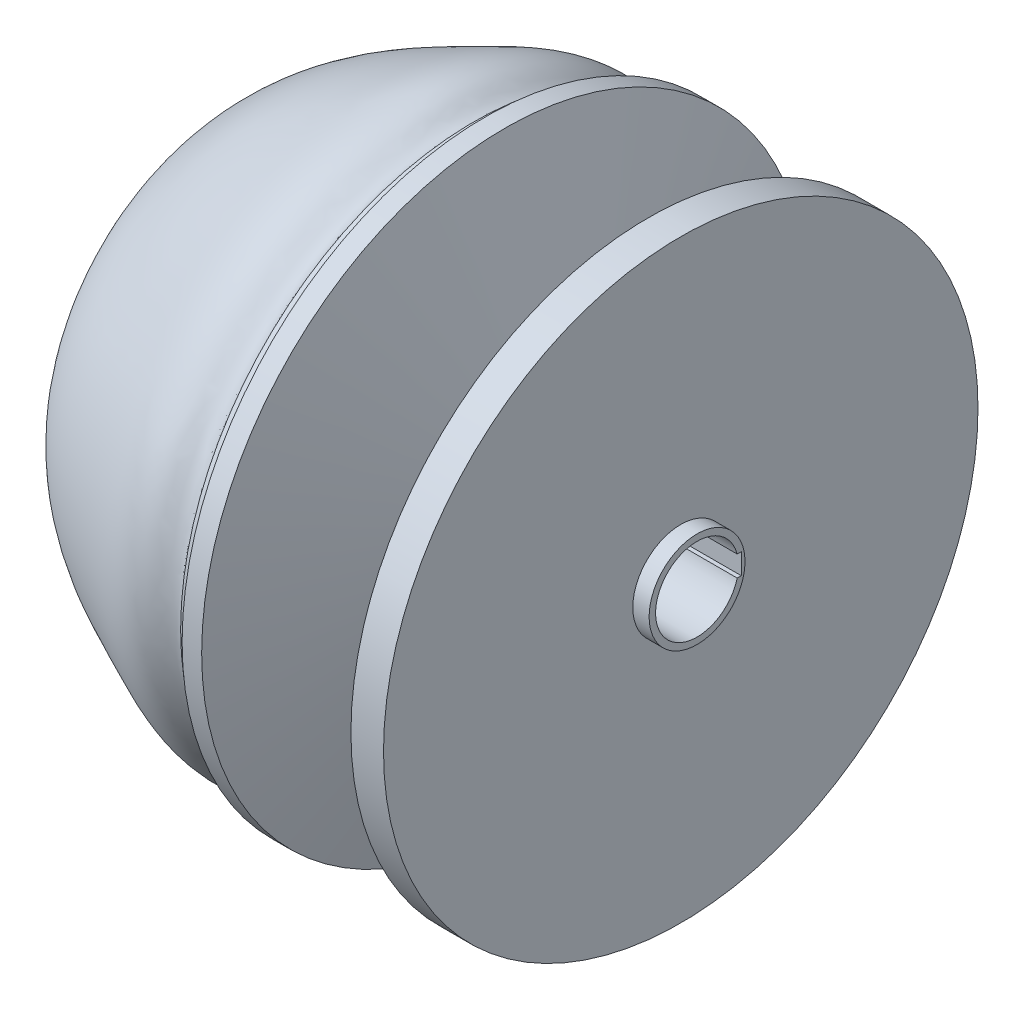
ISO-10303-21;
HEADER;
FILE_DESCRIPTION(('STEP AP214'),'2;1');
FILE_NAME('part.step','',(''),(''),'','','');
FILE_SCHEMA(('AUTOMOTIVE_DESIGN { 1 0 10303 214 1 1 1 1 }'));
ENDSEC;
DATA;
#1=APPLICATION_CONTEXT('core data for automotive mechanical design processes');
#2=APPLICATION_PROTOCOL_DEFINITION('international standard','automotive_design',2000,#1);
#3=PRODUCT_CONTEXT('',#1,'mechanical');
#4=PRODUCT('Part','Part','',(#3));
#5=PRODUCT_RELATED_PRODUCT_CATEGORY('part','',(#4));
#6=PRODUCT_DEFINITION_FORMATION('','',#4);
#7=PRODUCT_DEFINITION_CONTEXT('part definition',#1,'design');
#8=PRODUCT_DEFINITION('design','',#6,#7);
#9=PRODUCT_DEFINITION_SHAPE('','',#8);
#10=(LENGTH_UNIT() NAMED_UNIT(*) SI_UNIT(.MILLI.,.METRE.));
#11=(NAMED_UNIT(*) PLANE_ANGLE_UNIT() SI_UNIT($,.RADIAN.));
#12=(NAMED_UNIT(*) SI_UNIT($,.STERADIAN.) SOLID_ANGLE_UNIT());
#13=UNCERTAINTY_MEASURE_WITH_UNIT(LENGTH_MEASURE(1.E-05),#10,'distance_accuracy_value','');
#14=(GEOMETRIC_REPRESENTATION_CONTEXT(3) GLOBAL_UNCERTAINTY_ASSIGNED_CONTEXT((#13)) GLOBAL_UNIT_ASSIGNED_CONTEXT((#10,
#11,#12)) REPRESENTATION_CONTEXT('',''));
#15=CARTESIAN_POINT('',(0.,0.,0.));
#16=DIRECTION('',(0.,0.,1.));
#17=DIRECTION('',(1.,0.,0.));
#18=AXIS2_PLACEMENT_3D('',#15,#16,#17);
#19=CARTESIAN_POINT('',(79.335001792058,14.7092942906539,0.));
#20=DIRECTION('',(-1.,0.,0.));
#21=DIRECTION('',(0.,0.,1.));
#22=AXIS2_PLACEMENT_3D('',#19,#20,#21);
#23=PLANE('',#22);
#24=DIRECTION('',(0.,1.,0.));
#25=VECTOR('',#24,1.);
#26=CARTESIAN_POINT('',(79.335001792058,3.1875,-13.5635));
#27=LINE('',#26,#25);
#28=CARTESIAN_POINT('',(79.335001792058,-3.1875,-13.5635));
#29=VERTEX_POINT('',#28);
#30=CARTESIAN_POINT('',(79.335001792058,3.1875,-13.5635));
#31=VERTEX_POINT('',#30);
#32=EDGE_CURVE('E79',#29,#31,#27,.T.);
#33=ORIENTED_EDGE('',*,*,#32,.F.);
#34=DIRECTION('',(0.,0.,-1.));
#35=VECTOR('',#34,1.);
#36=CARTESIAN_POINT('',(79.335001792058,-3.1875,-11.8725));
#37=LINE('',#36,#35);
#38=CARTESIAN_POINT('',(79.335001792058,-3.1875,-12.3120821858043));
#39=VERTEX_POINT('',#38);
#40=EDGE_CURVE('E90',#39,#29,#37,.T.);
#41=ORIENTED_EDGE('',*,*,#40,.F.);
#42=CARTESIAN_POINT('',(79.335001792058,0.,0.));
#43=DIRECTION('',(1.,0.,0.));
#44=DIRECTION('',(0.,0.,-1.));
#45=AXIS2_PLACEMENT_3D('',#42,#43,#44);
#46=CIRCLE('',#45,12.718);
#47=CARTESIAN_POINT('',(79.335001792058,3.1875,-12.3120821858043));
#48=VERTEX_POINT('',#47);
#49=EDGE_CURVE('E102',#48,#39,#46,.T.);
#50=ORIENTED_EDGE('',*,*,#49,.F.);
#51=DIRECTION('',(0.,0.,1.));
#52=VECTOR('',#51,1.);
#53=CARTESIAN_POINT('',(79.335001792058,3.1875,-11.8725));
#54=LINE('',#53,#52);
#55=EDGE_CURVE('E92',#31,#48,#54,.T.);
#56=ORIENTED_EDGE('',*,*,#55,.F.);
#57=EDGE_LOOP('',(#33,#41,#50,#56));
#58=FACE_BOUND('',#57,.T.);
#59=CARTESIAN_POINT('',(79.335001792058,0.,0.));
#60=DIRECTION('',(-1.,0.,0.));
#61=DIRECTION('',(0.,0.,1.));
#62=AXIS2_PLACEMENT_3D('',#59,#60,#61);
#63=CIRCLE('',#62,14.7092942906539);
#64=CARTESIAN_POINT('',(79.335001792058,0.,14.7092942906539));
#65=VERTEX_POINT('',#64);
#66=EDGE_CURVE('E165',#65,#65,#63,.T.);
#67=ORIENTED_EDGE('',*,*,#66,.F.);
#68=EDGE_LOOP('',(#67));
#69=FACE_BOUND('',#68,.T.);
#70=ADVANCED_FACE('F33',(#58,#69),#23,.F.);
#71=CARTESIAN_POINT('',(-81.8356888062701,0.,0.));
#72=DIRECTION('',(-1.,0.,0.));
#73=DIRECTION('',(0.,0.,1.));
#74=AXIS2_PLACEMENT_3D('',#71,#72,#73);
#75=CYLINDRICAL_SURFACE('',#74,14.7092942906539);
#76=CARTESIAN_POINT('',(74.335001792058,0.,0.));
#77=DIRECTION('',(-1.,0.,0.));
#78=DIRECTION('',(0.,0.,1.));
#79=AXIS2_PLACEMENT_3D('',#76,#77,#78);
#80=CIRCLE('',#79,14.7092942906539);
#81=CARTESIAN_POINT('',(74.335001792058,0.,14.7092942906539));
#82=VERTEX_POINT('',#81);
#83=EDGE_CURVE('E168',#82,#82,#80,.T.);
#84=ORIENTED_EDGE('',*,*,#83,.F.);
#85=EDGE_LOOP('',(#84));
#86=FACE_BOUND('',#85,.T.);
#87=ORIENTED_EDGE('',*,*,#66,.T.);
#88=EDGE_LOOP('',(#87));
#89=FACE_BOUND('',#88,.T.);
#90=ADVANCED_FACE('F153',(#86,#89),#75,.T.);
#91=CARTESIAN_POINT('',(74.335001792058,91.2021540942188,0.));
#92=DIRECTION('',(-1.,0.,0.));
#93=DIRECTION('',(0.,0.,1.));
#94=AXIS2_PLACEMENT_3D('',#91,#92,#93);
#95=PLANE('',#94);
#96=CARTESIAN_POINT('',(74.3350017920579,0.,0.));
#97=DIRECTION('',(-1.,0.,0.));
#98=DIRECTION('',(0.,0.,1.));
#99=AXIS2_PLACEMENT_3D('',#96,#97,#98);
#100=CIRCLE('',#99,91.2021540942188);
#101=CARTESIAN_POINT('',(74.3350017920579,0.,91.2021540942188));
#102=VERTEX_POINT('',#101);
#103=EDGE_CURVE('E174',#102,#102,#100,.T.);
#104=ORIENTED_EDGE('',*,*,#103,.F.);
#105=EDGE_LOOP('',(#104));
#106=FACE_BOUND('',#105,.T.);
#107=ORIENTED_EDGE('',*,*,#83,.T.);
#108=EDGE_LOOP('',(#107));
#109=FACE_BOUND('',#108,.T.);
#110=ADVANCED_FACE('F149',(#106,#109),#95,.F.);
#111=CARTESIAN_POINT('',(-81.8356888062701,0.,0.));
#112=DIRECTION('',(-1.,0.,0.));
#113=DIRECTION('',(0.,0.,1.));
#114=AXIS2_PLACEMENT_3D('',#111,#112,#113);
#115=CYLINDRICAL_SURFACE('',#114,91.2021540942188);
#116=CARTESIAN_POINT('',(64.335001792058,0.,0.));
#117=DIRECTION('',(-1.,0.,0.));
#118=DIRECTION('',(0.,0.,1.));
#119=AXIS2_PLACEMENT_3D('',#116,#117,#118);
#120=CIRCLE('',#119,91.2021540942188);
#121=CARTESIAN_POINT('',(64.335001792058,0.,-91.2021540942188));
#122=VERTEX_POINT('',#121);
#123=EDGE_CURVE('E242',#122,#122,#120,.T.);
#124=ORIENTED_EDGE('',*,*,#123,.F.);
#125=EDGE_LOOP('',(#124));
#126=FACE_BOUND('',#125,.T.);
#127=ORIENTED_EDGE('',*,*,#103,.T.);
#128=EDGE_LOOP('',(#127));
#129=FACE_BOUND('',#128,.T.);
#130=ADVANCED_FACE('F145',(#126,#129),#115,.T.);
#131=CARTESIAN_POINT('',(64.335001792058,0.,0.));
#132=DIRECTION('',(1.,0.,0.));
#133=DIRECTION('',(0.,0.,-1.));
#134=AXIS2_PLACEMENT_3D('',#131,#132,#133);
#135=CONICAL_SURFACE('',#134,91.2021540942188,1.43431993025358);
#136=CARTESIAN_POINT('',(53.8701534911254,0.,0.));
#137=DIRECTION('',(-1.,0.,0.));
#138=DIRECTION('',(0.,0.,1.));
#139=AXIS2_PLACEMENT_3D('',#136,#137,#138);
#140=CIRCLE('',#139,15.);
#141=CARTESIAN_POINT('',(53.8701534911254,0.,-15.0000000000001));
#142=VERTEX_POINT('',#141);
#143=EDGE_CURVE('E239',#142,#142,#140,.T.);
#144=CARTESIAN_POINT('',(53.8701534911254,0.,-15.0000000000001));
#145=CARTESIAN_POINT('',(53.9791623275935,0.,-15.7937724384815));
#146=CARTESIAN_POINT('',(54.0881711640615,0.,-16.587544876963));
#147=CARTESIAN_POINT('',(54.3061888369976,0.,-18.1750897539258));
#148=CARTESIAN_POINT('',(54.4151976734657,0.,-18.9688621924073));
#149=CARTESIAN_POINT('',(54.6332153464018,0.,-20.5564070693702));
#150=CARTESIAN_POINT('',(54.7422241828698,0.,-21.3501795078516));
#151=CARTESIAN_POINT('',(54.9602418558059,0.,-22.9377243848145));
#152=CARTESIAN_POINT('',(55.069250692274,0.,-23.731496823296));
#153=CARTESIAN_POINT('',(55.2872683652101,0.,-25.3190417002589));
#154=CARTESIAN_POINT('',(55.3962772016781,0.,-26.1128141387403));
#155=CARTESIAN_POINT('',(55.6142948746142,0.,-27.7003590157032));
#156=CARTESIAN_POINT('',(55.7233037110823,0.,-28.4941314541846));
#157=CARTESIAN_POINT('',(55.9413213840183,0.,-30.0816763311475));
#158=CARTESIAN_POINT('',(56.0503302204864,0.,-30.875448769629));
#159=CARTESIAN_POINT('',(56.2683478934225,0.,-32.4629936465919));
#160=CARTESIAN_POINT('',(56.3773567298905,0.,-33.2567660850733));
#161=CARTESIAN_POINT('',(56.5953744028266,0.,-34.8443109620362));
#162=CARTESIAN_POINT('',(56.7043832392947,0.,-35.6380834005176));
#163=CARTESIAN_POINT('',(56.9224009122308,0.,-37.2256282774805));
#164=CARTESIAN_POINT('',(57.0314097486988,0.,-38.019400715962));
#165=CARTESIAN_POINT('',(57.2494274216349,0.,-39.6069455929249));
#166=CARTESIAN_POINT('',(57.358436258103,0.,-40.4007180314063));
#167=CARTESIAN_POINT('',(57.5764539310391,0.,-41.9882629083692));
#168=CARTESIAN_POINT('',(57.6854627675071,0.,-42.7820353468506));
#169=CARTESIAN_POINT('',(57.9034804404432,0.,-44.3695802238135));
#170=CARTESIAN_POINT('',(58.0124892769112,0.,-45.163352662295));
#171=CARTESIAN_POINT('',(58.2305069498473,0.,-46.7508975392579));
#172=CARTESIAN_POINT('',(58.3395157863154,0.,-47.5446699777393));
#173=CARTESIAN_POINT('',(58.5575334592515,0.,-49.1322148547022));
#174=CARTESIAN_POINT('',(58.6665422957195,0.,-49.9259872931837));
#175=CARTESIAN_POINT('',(58.8845599686556,0.,-51.5135321701465));
#176=CARTESIAN_POINT('',(58.9935688051237,0.,-52.307304608628));
#177=CARTESIAN_POINT('',(59.2115864780598,0.,-53.8948494855909));
#178=CARTESIAN_POINT('',(59.3205953145278,0.,-54.6886219240723));
#179=CARTESIAN_POINT('',(59.5386129874639,0.,-56.2761668010352));
#180=CARTESIAN_POINT('',(59.6476218239319,0.,-57.0699392395167));
#181=CARTESIAN_POINT('',(59.865639496868,0.,-58.6574841164796));
#182=CARTESIAN_POINT('',(59.9746483333361,0.,-59.451256554961));
#183=CARTESIAN_POINT('',(60.1926660062722,0.,-61.0388014319239));
#184=CARTESIAN_POINT('',(60.3016748427402,0.,-61.8325738704053));
#185=CARTESIAN_POINT('',(60.5196925156763,0.,-63.4201187473682));
#186=CARTESIAN_POINT('',(60.6287013521444,0.,-64.2138911858497));
#187=CARTESIAN_POINT('',(60.8467190250805,0.,-65.8014360628126));
#188=CARTESIAN_POINT('',(60.9557278615485,0.,-66.595208501294));
#189=CARTESIAN_POINT('',(61.1737455344846,0.,-68.1827533782569));
#190=CARTESIAN_POINT('',(61.2827543709526,0.,-68.9765258167384));
#191=CARTESIAN_POINT('',(61.5007720438887,0.,-70.5640706937012));
#192=CARTESIAN_POINT('',(61.6097808803568,0.,-71.3578431321827));
#193=CARTESIAN_POINT('',(61.8277985532929,0.,-72.9453880091456));
#194=CARTESIAN_POINT('',(61.9368073897609,0.,-73.739160447627));
#195=CARTESIAN_POINT('',(62.154825062697,0.,-75.3267053245899));
#196=CARTESIAN_POINT('',(62.2638338991651,0.,-76.1204777630714));
#197=CARTESIAN_POINT('',(62.4818515721012,0.,-77.7080226400342));
#198=CARTESIAN_POINT('',(62.5908604085692,0.,-78.5017950785157));
#199=CARTESIAN_POINT('',(62.8088780815053,0.,-80.0893399554786));
#200=CARTESIAN_POINT('',(62.9178869179734,0.,-80.88311239396));
#201=CARTESIAN_POINT('',(63.1359045909094,0.,-82.4706572709229));
#202=CARTESIAN_POINT('',(63.2449134273775,0.,-83.2644297094044));
#203=CARTESIAN_POINT('',(63.4629311003136,0.,-84.8519745863672));
#204=CARTESIAN_POINT('',(63.5719399367816,0.,-85.6457470248487));
#205=CARTESIAN_POINT('',(63.7899576097177,0.,-87.2332919018116));
#206=CARTESIAN_POINT('',(63.8989664461858,0.,-88.027064340293));
#207=CARTESIAN_POINT('',(64.1169841191219,0.,-89.6146092172559));
#208=CARTESIAN_POINT('',(64.2259929555899,0.,-90.4083816557374));
#209=CARTESIAN_POINT('',(64.335001792058,0.,-91.2021540942188));
#210=B_SPLINE_CURVE_WITH_KNOTS('',3,(#144,#145,#146,#147,#148,#149,#150,#151,#152,#153,#154,
#155,#156,#157,#158,#159,#160,#161,#162,#163,#164,#165,#166,#167,#168,#169,#170,#171,#172,#173,
#174,#175,#176,#177,#178,#179,#180,#181,#182,#183,#184,#185,#186,#187,#188,#189,#190,#191,#192,
#193,#194,#195,#196,#197,#198,#199,#200,#201,#202,#203,#204,#205,#206,#207,#208,#209),
.UNSPECIFIED.,.F.,.F.,(4,2,2,2,2,2,2,2,2,2,2,2,2,2,2,2,2,2,2,2,2,2,2,2,2,2,2,2,2,2,2,2,4),(0.,
2.40366771719555,4.80733543439109,7.21100315158666,9.6146708687822,12.0183385859777,
14.4220063031733,16.8256740203689,19.2293417375644,21.63300945476,24.0366771719555,
26.4403448891511,28.8440126063466,31.2476803235422,33.6513480407377,36.0550157579333,
38.4586834751288,40.8623511923244,43.2660189095199,45.6696866267155,48.073354343911,
50.4770220611066,52.8806897783021,55.2843574954977,57.6880252126932,60.0916929298888,
62.4953606470843,64.8990283642799,67.3026960814754,69.706363798671,72.1100315158666,
74.5136992330621,76.9173669502577),.UNSPECIFIED.);
#211=EDGE_CURVE('BSEAM141',#142,#122,#210,.T.);
#212=ORIENTED_EDGE('',*,*,#143,.F.);
#213=ORIENTED_EDGE('',*,*,#123,.T.);
#214=ORIENTED_EDGE('',*,*,#211,.T.);
#215=ORIENTED_EDGE('',*,*,#211,.F.);
#216=EDGE_LOOP('',(#212,#214,#213,#215));
#217=FACE_BOUND('',#216,.T.);
#218=ADVANCED_FACE('F141',(#217),#135,.T.);
#219=CARTESIAN_POINT('',(-81.8356888062701,0.,0.));
#220=DIRECTION('',(-1.,0.,0.));
#221=DIRECTION('',(0.,0.,1.));
#222=AXIS2_PLACEMENT_3D('',#219,#220,#221);
#223=CYLINDRICAL_SURFACE('',#222,15.);
#224=CARTESIAN_POINT('',(41.2271543373421,0.,0.));
#225=DIRECTION('',(-1.,0.,0.));
#226=DIRECTION('',(0.,0.,1.));
#227=AXIS2_PLACEMENT_3D('',#224,#225,#226);
#228=CIRCLE('',#227,15.);
#229=CARTESIAN_POINT('',(41.2271543373421,0.,15.));
#230=VERTEX_POINT('',#229);
#231=EDGE_CURVE('E236',#230,#230,#228,.T.);
#232=ORIENTED_EDGE('',*,*,#231,.F.);
#233=EDGE_LOOP('',(#232));
#234=FACE_BOUND('',#233,.T.);
#235=ORIENTED_EDGE('',*,*,#143,.T.);
#236=EDGE_LOOP('',(#235));
#237=FACE_BOUND('',#236,.T.);
#238=ADVANCED_FACE('F137',(#234,#237),#223,.T.);
#239=CARTESIAN_POINT('',(41.2271543373421,0.,0.));
#240=DIRECTION('',(-1.,0.,0.));
#241=DIRECTION('',(0.,0.,1.));
#242=AXIS2_PLACEMENT_3D('',#239,#240,#241);
#243=CONICAL_SURFACE('',#242,15.,1.30909125298629);
#244=CARTESIAN_POINT('',(20.335001792058,0.,0.));
#245=DIRECTION('',(-1.,0.,0.));
#246=DIRECTION('',(0.,0.,1.));
#247=AXIS2_PLACEMENT_3D('',#244,#245,#246);
#248=CIRCLE('',#247,93.);
#249=CARTESIAN_POINT('',(20.335001792058,0.,93.));
#250=VERTEX_POINT('',#249);
#251=EDGE_CURVE('E233',#250,#250,#248,.T.);
#252=CARTESIAN_POINT('',(20.335001792058,0.,93.));
#253=CARTESIAN_POINT('',(20.5526283810713,0.,92.1875));
#254=CARTESIAN_POINT('',(20.7702549700847,0.,91.375));
#255=CARTESIAN_POINT('',(21.2055081481115,0.,89.75));
#256=CARTESIAN_POINT('',(21.4231347371248,0.,88.9375));
#257=CARTESIAN_POINT('',(21.8583879151516,0.,87.3125));
#258=CARTESIAN_POINT('',(22.076014504165,0.,86.5));
#259=CARTESIAN_POINT('',(22.5112676821917,0.,84.875));
#260=CARTESIAN_POINT('',(22.7288942712051,0.,84.0625));
#261=CARTESIAN_POINT('',(23.1641474492319,0.,82.4375));
#262=CARTESIAN_POINT('',(23.3817740382452,0.,81.625));
#263=CARTESIAN_POINT('',(23.817027216272,0.,80.));
#264=CARTESIAN_POINT('',(24.0346538052854,0.,79.1875));
#265=CARTESIAN_POINT('',(24.4699069833121,0.,77.5625));
#266=CARTESIAN_POINT('',(24.6875335723255,0.,76.75));
#267=CARTESIAN_POINT('',(25.1227867503522,0.,75.125));
#268=CARTESIAN_POINT('',(25.3404133393656,0.,74.3125));
#269=CARTESIAN_POINT('',(25.7756665173924,0.,72.6875));
#270=CARTESIAN_POINT('',(25.9932931064058,0.,71.875));
#271=CARTESIAN_POINT('',(26.4285462844325,0.,70.25));
#272=CARTESIAN_POINT('',(26.6461728734459,0.,69.4375));
#273=CARTESIAN_POINT('',(27.0814260514726,0.,67.8125));
#274=CARTESIAN_POINT('',(27.299052640486,0.,67.));
#275=CARTESIAN_POINT('',(27.7343058185128,0.,65.375));
#276=CARTESIAN_POINT('',(27.9519324075261,0.,64.5625));
#277=CARTESIAN_POINT('',(28.3871855855529,0.,62.9375));
#278=CARTESIAN_POINT('',(28.6048121745663,0.,62.125));
#279=CARTESIAN_POINT('',(29.040065352593,0.,60.5));
#280=CARTESIAN_POINT('',(29.2576919416064,0.,59.6875));
#281=CARTESIAN_POINT('',(29.6929451196332,0.,58.0625));
#282=CARTESIAN_POINT('',(29.9105717086465,0.,57.25));
#283=CARTESIAN_POINT('',(30.3458248866733,0.,55.625));
#284=CARTESIAN_POINT('',(30.5634514756867,0.,54.8125));
#285=CARTESIAN_POINT('',(30.9987046537134,0.,53.1875));
#286=CARTESIAN_POINT('',(31.2163312427268,0.,52.375));
#287=CARTESIAN_POINT('',(31.6515844207536,0.,50.75));
#288=CARTESIAN_POINT('',(31.8692110097669,0.,49.9375));
#289=CARTESIAN_POINT('',(32.3044641877937,0.,48.3125));
#290=CARTESIAN_POINT('',(32.5220907768071,0.,47.5));
#291=CARTESIAN_POINT('',(32.9573439548338,0.,45.875));
#292=CARTESIAN_POINT('',(33.1749705438472,0.,45.0625));
#293=CARTESIAN_POINT('',(33.610223721874,0.,43.4375));
#294=CARTESIAN_POINT('',(33.8278503108873,0.,42.625));
#295=CARTESIAN_POINT('',(34.2631034889141,0.,41.));
#296=CARTESIAN_POINT('',(34.4807300779275,0.,40.1875));
#297=CARTESIAN_POINT('',(34.9159832559542,0.,38.5625));
#298=CARTESIAN_POINT('',(35.1336098449676,0.,37.75));
#299=CARTESIAN_POINT('',(35.5688630229943,0.,36.125));
#300=CARTESIAN_POINT('',(35.7864896120077,0.,35.3125));
#301=CARTESIAN_POINT('',(36.2217427900345,0.,33.6875));
#302=CARTESIAN_POINT('',(36.4393693790478,0.,32.875));
#303=CARTESIAN_POINT('',(36.8746225570746,0.,31.25));
#304=CARTESIAN_POINT('',(37.092249146088,0.,30.4375));
#305=CARTESIAN_POINT('',(37.5275023241147,0.,28.8125));
#306=CARTESIAN_POINT('',(37.7451289131281,0.,28.));
#307=CARTESIAN_POINT('',(38.1803820911549,0.,26.375));
#308=CARTESIAN_POINT('',(38.3980086801682,0.,25.5625));
#309=CARTESIAN_POINT('',(38.833261858195,0.,23.9375));
#310=CARTESIAN_POINT('',(39.0508884472084,0.,23.125));
#311=CARTESIAN_POINT('',(39.4861416252351,0.,21.5));
#312=CARTESIAN_POINT('',(39.7037682142485,0.,20.6875));
#313=CARTESIAN_POINT('',(40.1390213922753,0.,19.0625));
#314=CARTESIAN_POINT('',(40.3566479812886,0.,18.25));
#315=CARTESIAN_POINT('',(40.7919011593154,0.,16.625));
#316=CARTESIAN_POINT('',(41.0095277483288,0.,15.8125));
#317=CARTESIAN_POINT('',(41.2271543373421,0.,15.));
#318=B_SPLINE_CURVE_WITH_KNOTS('',3,(#252,#253,#254,#255,#256,#257,#258,#259,#260,#261,#262,
#263,#264,#265,#266,#267,#268,#269,#270,#271,#272,#273,#274,#275,#276,#277,#278,#279,#280,#281,
#282,#283,#284,#285,#286,#287,#288,#289,#290,#291,#292,#293,#294,#295,#296,#297,#298,#299,#300,
#301,#302,#303,#304,#305,#306,#307,#308,#309,#310,#311,#312,#313,#314,#315,#316,#317),
.UNSPECIFIED.,.F.,.F.,(4,2,2,2,2,2,2,2,2,2,2,2,2,2,2,2,2,2,2,2,2,2,2,2,2,2,2,2,2,2,2,2,4),(0.,
2.52342193067478,5.04684386134954,7.57026579202432,10.0936877226991,12.6171096533738,
15.1405315840486,17.6639535147234,20.1873754453981,22.7107973760729,25.2342193067477,
27.7576412374225,30.2810631680972,32.804485098772,35.3279070294468,37.8513289601215,
40.3747508907963,42.8981728214711,45.4215947521459,47.9450166828206,50.4684386134954,
52.9918605441702,55.5152824748449,58.0387044055197,60.5621263361945,63.0855482668692,
65.608970197544,68.1323921282188,70.6558140588935,73.1792359895683,75.7026579202431,
78.2260798509179,80.7495017815926),.UNSPECIFIED.);
#319=EDGE_CURVE('BSEAM133',#250,#230,#318,.T.);
#320=ORIENTED_EDGE('',*,*,#251,.F.);
#321=ORIENTED_EDGE('',*,*,#231,.T.);
#322=ORIENTED_EDGE('',*,*,#319,.T.);
#323=ORIENTED_EDGE('',*,*,#319,.F.);
#324=EDGE_LOOP('',(#320,#322,#321,#323));
#325=FACE_BOUND('',#324,.T.);
#326=ADVANCED_FACE('F133',(#325),#243,.T.);
#327=CARTESIAN_POINT('',(-81.8356888062701,0.,0.));
#328=DIRECTION('',(-1.,0.,0.));
#329=DIRECTION('',(0.,0.,1.));
#330=AXIS2_PLACEMENT_3D('',#327,#328,#329);
#331=CYLINDRICAL_SURFACE('',#330,93.);
#332=CARTESIAN_POINT('',(14.335001792058,0.,0.));
#333=DIRECTION('',(-1.,0.,0.));
#334=DIRECTION('',(0.,0.,1.));
#335=AXIS2_PLACEMENT_3D('',#332,#333,#334);
#336=CIRCLE('',#335,93.);
#337=CARTESIAN_POINT('',(14.335001792058,0.,93.));
#338=VERTEX_POINT('',#337);
#339=EDGE_CURVE('E230',#338,#338,#336,.T.);
#340=ORIENTED_EDGE('',*,*,#339,.F.);
#341=EDGE_LOOP('',(#340));
#342=FACE_BOUND('',#341,.T.);
#343=ORIENTED_EDGE('',*,*,#251,.T.);
#344=EDGE_LOOP('',(#343));
#345=FACE_BOUND('',#344,.T.);
#346=ADVANCED_FACE('F129',(#342,#345),#331,.T.);
#347=CARTESIAN_POINT('',(14.335001792058,90.,0.));
#348=DIRECTION('',(1.,0.,0.));
#349=DIRECTION('',(0.,0.,-1.));
#350=AXIS2_PLACEMENT_3D('',#347,#348,#349);
#351=PLANE('',#350);
#352=CARTESIAN_POINT('',(14.335001792058,0.,0.));
#353=DIRECTION('',(-1.,0.,0.));
#354=DIRECTION('',(0.,0.,1.));
#355=AXIS2_PLACEMENT_3D('',#352,#353,#354);
#356=CIRCLE('',#355,90.);
#357=CARTESIAN_POINT('',(14.335001792058,0.,90.));
#358=VERTEX_POINT('',#357);
#359=EDGE_CURVE('E227',#358,#358,#356,.T.);
#360=ORIENTED_EDGE('',*,*,#359,.F.);
#361=EDGE_LOOP('',(#360));
#362=FACE_BOUND('',#361,.T.);
#363=ORIENTED_EDGE('',*,*,#339,.T.);
#364=EDGE_LOOP('',(#363));
#365=FACE_BOUND('',#364,.T.);
#366=ADVANCED_FACE('F125',(#362,#365),#351,.F.);
#367=CARTESIAN_POINT('',(-81.8356888062701,0.,0.));
#368=DIRECTION('',(-1.,0.,0.));
#369=DIRECTION('',(0.,0.,1.));
#370=AXIS2_PLACEMENT_3D('',#367,#368,#369);
#371=CYLINDRICAL_SURFACE('',#370,90.);
#372=CARTESIAN_POINT('',(10.8810803707311,0.,0.));
#373=DIRECTION('',(-1.,0.,0.));
#374=DIRECTION('',(0.,0.,1.));
#375=AXIS2_PLACEMENT_3D('',#372,#373,#374);
#376=CIRCLE('',#375,90.);
#377=CARTESIAN_POINT('',(10.8810803707311,0.,90.));
#378=VERTEX_POINT('',#377);
#379=EDGE_CURVE('E222',#378,#378,#376,.T.);
#380=ORIENTED_EDGE('',*,*,#379,.F.);
#381=EDGE_LOOP('',(#380));
#382=FACE_BOUND('',#381,.T.);
#383=ORIENTED_EDGE('',*,*,#359,.T.);
#384=EDGE_LOOP('',(#383));
#385=FACE_BOUND('',#384,.T.);
#386=ADVANCED_FACE('F120',(#382,#385),#371,.T.);
#387=CARTESIAN_POINT('',(10.8810803707311,90.,0.));
#388=CARTESIAN_POINT('',(6.89907044902701,82.6165685508482,0.));
#389=CARTESIAN_POINT('',(-2.5693667690275,92.818520505995,0.));
#390=CARTESIAN_POINT('',(-24.9005616436251,82.171389104483,0.));
#391=CARTESIAN_POINT('',(-53.0865995369759,70.2231276655671,0.));
#392=CARTESIAN_POINT('',(-72.1206100900511,49.6249276813252,0.));
#393=CARTESIAN_POINT('',(-70.911998207942,32.718,0.));
#394=B_SPLINE_CURVE_WITH_KNOTS('',3,(#387,#388,#389,#390,#391,#392,#393),.UNSPECIFIED.,.F.,.F.,
(4,1,1,1,4),(0.,0.109618965281745,0.316348593626144,0.57543441616019,1.),.UNSPECIFIED.);
#395=CARTESIAN_POINT('',(-81.8356888062701,0.,0.));
#396=DIRECTION('',(-1.,0.,0.));
#397=AXIS1_PLACEMENT('',#395,#396);
#398=SURFACE_OF_REVOLUTION('',#394,#397);
#399=CARTESIAN_POINT('',(-70.911998207942,0.,0.));
#400=DIRECTION('',(-1.,0.,0.));
#401=DIRECTION('',(0.,0.,1.));
#402=AXIS2_PLACEMENT_3D('',#399,#400,#401);
#403=CIRCLE('',#402,32.718);
#404=CARTESIAN_POINT('',(-70.911998207942,0.,32.718));
#405=VERTEX_POINT('',#404);
#406=EDGE_CURVE('E220',#405,#405,#403,.T.);
#407=ORIENTED_EDGE('',*,*,#406,.F.);
#408=EDGE_LOOP('',(#407));
#409=FACE_BOUND('',#408,.T.);
#410=ORIENTED_EDGE('',*,*,#379,.T.);
#411=EDGE_LOOP('',(#410));
#412=FACE_BOUND('',#411,.T.);
#413=ADVANCED_FACE('F115',(#409,#412),#398,.T.);
#414=CARTESIAN_POINT('',(-70.911998207942,12.718,0.));
#415=DIRECTION('',(1.,0.,0.));
#416=DIRECTION('',(0.,0.,-1.));
#417=AXIS2_PLACEMENT_3D('',#414,#415,#416);
#418=PLANE('',#417);
#419=CARTESIAN_POINT('',(-70.911998207942,0.,0.));
#420=DIRECTION('',(-1.,0.,0.));
#421=DIRECTION('',(0.,0.,1.));
#422=AXIS2_PLACEMENT_3D('',#419,#420,#421);
#423=CIRCLE('',#422,12.718);
#424=CARTESIAN_POINT('',(-70.911998207942,0.,12.718));
#425=VERTEX_POINT('',#424);
#426=EDGE_CURVE('E219',#425,#425,#423,.T.);
#427=ORIENTED_EDGE('',*,*,#426,.F.);
#428=EDGE_LOOP('',(#427));
#429=FACE_BOUND('',#428,.T.);
#430=ORIENTED_EDGE('',*,*,#406,.T.);
#431=EDGE_LOOP('',(#430));
#432=FACE_BOUND('',#431,.T.);
#433=ADVANCED_FACE('F119',(#429,#432),#418,.F.);
#434=CARTESIAN_POINT('',(-81.8356888062701,0.,0.));
#435=DIRECTION('',(-1.,0.,0.));
#436=DIRECTION('',(0.,0.,1.));
#437=AXIS2_PLACEMENT_3D('',#434,#435,#436);
#438=CYLINDRICAL_SURFACE('',#437,12.718);
#439=CARTESIAN_POINT('',(-80.911998207942,0.,0.));
#440=DIRECTION('',(-1.,0.,0.));
#441=DIRECTION('',(0.,0.,1.));
#442=AXIS2_PLACEMENT_3D('',#439,#440,#441);
#443=CIRCLE('',#442,12.718);
#444=CARTESIAN_POINT('',(-80.911998207942,0.,12.718));
#445=VERTEX_POINT('',#444);
#446=EDGE_CURVE('E105',#445,#445,#443,.T.);
#447=ORIENTED_EDGE('',*,*,#446,.F.);
#448=EDGE_LOOP('',(#447));
#449=FACE_BOUND('',#448,.T.);
#450=ORIENTED_EDGE('',*,*,#426,.T.);
#451=EDGE_LOOP('',(#450));
#452=FACE_BOUND('',#451,.T.);
#453=ADVANCED_FACE('F206',(#449,#452),#438,.T.);
#454=CARTESIAN_POINT('',(-80.911998207942,0.,0.));
#455=DIRECTION('',(1.,0.,0.));
#456=DIRECTION('',(0.,0.,-1.));
#457=AXIS2_PLACEMENT_3D('',#454,#455,#456);
#458=PLANE('',#457);
#459=CARTESIAN_POINT('',(-80.911998207942,0.,0.));
#460=DIRECTION('',(-1.,0.,0.));
#461=DIRECTION('',(0.,0.,1.));
#462=AXIS2_PLACEMENT_3D('',#459,#460,#461);
#463=CIRCLE('',#462,10.);
#464=CARTESIAN_POINT('',(-80.911998207942,0.,10.));
#465=VERTEX_POINT('',#464);
#466=EDGE_CURVE('E98',#465,#465,#463,.T.);
#467=ORIENTED_EDGE('',*,*,#466,.F.);
#468=EDGE_LOOP('',(#467));
#469=FACE_BOUND('',#468,.T.);
#470=ORIENTED_EDGE('',*,*,#446,.T.);
#471=EDGE_LOOP('',(#470));
#472=FACE_BOUND('',#471,.T.);
#473=ADVANCED_FACE('F204',(#469,#472),#458,.F.);
#474=CARTESIAN_POINT('',(-3.40499820794203,0.,0.));
#475=DIRECTION('',(1.,0.,0.));
#476=DIRECTION('',(0.,0.,-1.));
#477=AXIS2_PLACEMENT_3D('',#474,#475,#476);
#478=CYLINDRICAL_SURFACE('',#477,12.718);
#479=ORIENTED_EDGE('',*,*,#49,.T.);
#480=DIRECTION('',(1.,0.,0.));
#481=VECTOR('',#480,1.);
#482=CARTESIAN_POINT('',(-3.40499820794203,-3.1875,-12.3120821858043));
#483=LINE('',#482,#481);
#484=CARTESIAN_POINT('',(23.335001792058,-3.1875,-12.3120821858043));
#485=VERTEX_POINT('',#484);
#486=EDGE_CURVE('E11',#39,#485,#483,.F.);
#487=ORIENTED_EDGE('',*,*,#486,.T.);
#488=CARTESIAN_POINT('',(23.335001792058,0.,0.));
#489=DIRECTION('',(1.,0.,0.));
#490=DIRECTION('',(0.,0.,-1.));
#491=AXIS2_PLACEMENT_3D('',#488,#489,#490);
#492=CIRCLE('',#491,12.718);
#493=CARTESIAN_POINT('',(23.335001792058,3.1875,-12.3120821858043));
#494=VERTEX_POINT('',#493);
#495=EDGE_CURVE('E53',#494,#485,#492,.F.);
#496=ORIENTED_EDGE('',*,*,#495,.F.);
#497=DIRECTION('',(1.,0.,0.));
#498=VECTOR('',#497,1.);
#499=CARTESIAN_POINT('',(-3.40499820794203,3.1875,-12.3120821858043));
#500=LINE('',#499,#498);
#501=EDGE_CURVE('E41',#494,#48,#500,.T.);
#502=ORIENTED_EDGE('',*,*,#501,.T.);
#503=EDGE_LOOP('',(#479,#487,#496,#502));
#504=FACE_BOUND('',#503,.T.);
#505=CARTESIAN_POINT('',(-3.56781098385351,0.,0.));
#506=DIRECTION('',(1.,0.,0.));
#507=DIRECTION('',(0.,0.,-1.));
#508=AXIS2_PLACEMENT_3D('',#505,#506,#507);
#509=CIRCLE('',#508,12.718);
#510=CARTESIAN_POINT('',(-3.56781098385351,0.,-12.718));
#511=VERTEX_POINT('',#510);
#512=EDGE_CURVE('E171',#511,#511,#509,.F.);
#513=ORIENTED_EDGE('',*,*,#512,.T.);
#514=EDGE_LOOP('',(#513));
#515=FACE_BOUND('',#514,.T.);
#516=ADVANCED_FACE('F182',(#504,#515),#478,.F.);
#517=CARTESIAN_POINT('',(-1.40499820794202,0.,0.));
#518=DIRECTION('',(-1.,0.,0.));
#519=DIRECTION('',(0.,0.,1.));
#520=AXIS2_PLACEMENT_3D('',#517,#518,#519);
#521=CYLINDRICAL_SURFACE('',#520,10.);
#522=CARTESIAN_POINT('',(-5.13704901551094,0.,0.));
#523=DIRECTION('',(1.,0.,0.));
#524=DIRECTION('',(0.,0.,-1.));
#525=AXIS2_PLACEMENT_3D('',#522,#523,#524);
#526=CIRCLE('',#525,10.);
#527=CARTESIAN_POINT('',(-5.13704901551094,0.,-10.));
#528=VERTEX_POINT('',#527);
#529=EDGE_CURVE('E167',#528,#528,#526,.T.);
#530=ORIENTED_EDGE('',*,*,#529,.T.);
#531=EDGE_LOOP('',(#530));
#532=FACE_BOUND('',#531,.T.);
#533=ORIENTED_EDGE('',*,*,#466,.T.);
#534=EDGE_LOOP('',(#533));
#535=FACE_BOUND('',#534,.T.);
#536=ADVANCED_FACE('F193',(#532,#535),#521,.F.);
#537=CARTESIAN_POINT('',(-5.13704901551094,0.,0.));
#538=DIRECTION('',(1.,0.,0.));
#539=DIRECTION('',(0.,0.,-1.));
#540=AXIS2_PLACEMENT_3D('',#537,#538,#539);
#541=CONICAL_SURFACE('',#540,10.,1.04719755119659);
#542=ORIENTED_EDGE('',*,*,#512,.F.);
#543=EDGE_LOOP('',(#542));
#544=FACE_BOUND('',#543,.T.);
#545=ORIENTED_EDGE('',*,*,#529,.F.);
#546=EDGE_LOOP('',(#545));
#547=FACE_BOUND('',#546,.T.);
#548=ADVANCED_FACE('F35',(#544,#547),#541,.F.);
#549=CARTESIAN_POINT('',(23.335001792058,-3.1875,-11.8725));
#550=DIRECTION('',(0.,-1.,0.));
#551=DIRECTION('',(0.,0.,-1.));
#552=AXIS2_PLACEMENT_3D('',#549,#550,#551);
#553=PLANE('',#552);
#554=ORIENTED_EDGE('',*,*,#40,.T.);
#555=DIRECTION('',(1.,0.,0.));
#556=VECTOR('',#555,1.);
#557=CARTESIAN_POINT('',(23.335001792058,-3.1875,-13.5635));
#558=LINE('',#557,#556);
#559=CARTESIAN_POINT('',(23.335001792058,-3.1875,-13.5635));
#560=VERTEX_POINT('',#559);
#561=EDGE_CURVE('E82',#560,#29,#558,.T.);
#562=ORIENTED_EDGE('',*,*,#561,.F.);
#563=DIRECTION('',(0.,0.,-1.));
#564=VECTOR('',#563,1.);
#565=CARTESIAN_POINT('',(23.335001792058,-3.1875,-11.8725));
#566=LINE('',#565,#564);
#567=EDGE_CURVE('E83',#485,#560,#566,.T.);
#568=ORIENTED_EDGE('',*,*,#567,.F.);
#569=ORIENTED_EDGE('',*,*,#486,.F.);
#570=EDGE_LOOP('',(#554,#562,#568,#569));
#571=FACE_BOUND('',#570,.T.);
#572=ADVANCED_FACE('F185',(#571),#553,.F.);
#573=CARTESIAN_POINT('',(23.335001792058,3.1875,-11.8725));
#574=DIRECTION('',(0.,1.,0.));
#575=DIRECTION('',(0.,0.,1.));
#576=AXIS2_PLACEMENT_3D('',#573,#574,#575);
#577=PLANE('',#576);
#578=DIRECTION('',(0.,0.,1.));
#579=VECTOR('',#578,1.);
#580=CARTESIAN_POINT('',(23.335001792058,3.1875,-11.8725));
#581=LINE('',#580,#579);
#582=CARTESIAN_POINT('',(23.335001792058,3.1875,-13.5635));
#583=VERTEX_POINT('',#582);
#584=EDGE_CURVE('E48',#583,#494,#581,.T.);
#585=ORIENTED_EDGE('',*,*,#584,.F.);
#586=DIRECTION('',(1.,0.,0.));
#587=VECTOR('',#586,1.);
#588=CARTESIAN_POINT('',(23.335001792058,3.1875,-13.5635));
#589=LINE('',#588,#587);
#590=EDGE_CURVE('E74',#583,#31,#589,.T.);
#591=ORIENTED_EDGE('',*,*,#590,.T.);
#592=ORIENTED_EDGE('',*,*,#55,.T.);
#593=ORIENTED_EDGE('',*,*,#501,.F.);
#594=EDGE_LOOP('',(#585,#591,#592,#593));
#595=FACE_BOUND('',#594,.T.);
#596=ADVANCED_FACE('F85',(#595),#577,.F.);
#597=CARTESIAN_POINT('',(23.335001792058,0.,0.));
#598=DIRECTION('',(1.,0.,0.));
#599=DIRECTION('',(0.,0.,-1.));
#600=AXIS2_PLACEMENT_3D('',#597,#598,#599);
#601=PLANE('',#600);
#602=ORIENTED_EDGE('',*,*,#495,.T.);
#603=ORIENTED_EDGE('',*,*,#567,.T.);
#604=DIRECTION('',(0.,1.,0.));
#605=VECTOR('',#604,1.);
#606=CARTESIAN_POINT('',(23.335001792058,3.1875,-13.5635));
#607=LINE('',#606,#605);
#608=EDGE_CURVE('E77',#560,#583,#607,.T.);
#609=ORIENTED_EDGE('',*,*,#608,.T.);
#610=ORIENTED_EDGE('',*,*,#584,.T.);
#611=EDGE_LOOP('',(#602,#603,#609,#610));
#612=FACE_BOUND('',#611,.T.);
#613=ADVANCED_FACE('F88',(#612),#601,.T.);
#614=CARTESIAN_POINT('',(23.335001792058,3.1875,-13.5635));
#615=DIRECTION('',(0.,0.,-1.));
#616=DIRECTION('',(0.,1.,0.));
#617=AXIS2_PLACEMENT_3D('',#614,#615,#616);
#618=PLANE('',#617);
#619=ORIENTED_EDGE('',*,*,#32,.T.);
#620=ORIENTED_EDGE('',*,*,#590,.F.);
#621=ORIENTED_EDGE('',*,*,#608,.F.);
#622=ORIENTED_EDGE('',*,*,#561,.T.);
#623=EDGE_LOOP('',(#619,#620,#621,#622));
#624=FACE_BOUND('',#623,.T.);
#625=ADVANCED_FACE('F75',(#624),#618,.F.);
#626=CLOSED_SHELL('',(#70,#90,#110,#130,#218,#238,#326,#346,#366,#386,#413,#433,#453,#473,#516,
#536,#548,#572,#596,#613,#625));
#627=MANIFOLD_SOLID_BREP('B2',#626);
#628=ADVANCED_BREP_SHAPE_REPRESENTATION('',(#18,#627),#14);
#629=SHAPE_DEFINITION_REPRESENTATION(#9,#628);
ENDSEC;
END-ISO-10303-21;
